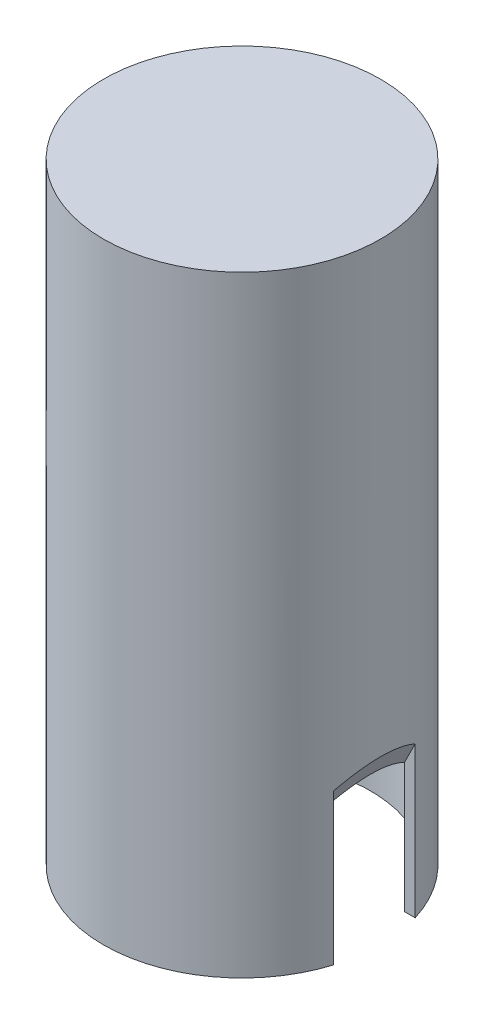
ISO-10303-21;
HEADER;
FILE_DESCRIPTION(('STEP AP214'),'2;1');
FILE_NAME('part.step','',(''),(''),'','','');
FILE_SCHEMA(('AUTOMOTIVE_DESIGN { 1 0 10303 214 1 1 1 1 }'));
ENDSEC;
DATA;
#1=APPLICATION_CONTEXT('core data for automotive mechanical design processes');
#2=APPLICATION_PROTOCOL_DEFINITION('international standard','automotive_design',2000,#1);
#3=PRODUCT_CONTEXT('',#1,'mechanical');
#4=PRODUCT('Part','Part','',(#3));
#5=PRODUCT_RELATED_PRODUCT_CATEGORY('part','',(#4));
#6=PRODUCT_DEFINITION_FORMATION('','',#4);
#7=PRODUCT_DEFINITION_CONTEXT('part definition',#1,'design');
#8=PRODUCT_DEFINITION('design','',#6,#7);
#9=PRODUCT_DEFINITION_SHAPE('','',#8);
#10=(LENGTH_UNIT() NAMED_UNIT(*) SI_UNIT(.MILLI.,.METRE.));
#11=(NAMED_UNIT(*) PLANE_ANGLE_UNIT() SI_UNIT($,.RADIAN.));
#12=(NAMED_UNIT(*) SI_UNIT($,.STERADIAN.) SOLID_ANGLE_UNIT());
#13=UNCERTAINTY_MEASURE_WITH_UNIT(LENGTH_MEASURE(1.E-05),#10,'distance_accuracy_value','');
#14=(GEOMETRIC_REPRESENTATION_CONTEXT(3) GLOBAL_UNCERTAINTY_ASSIGNED_CONTEXT((#13)) GLOBAL_UNIT_ASSIGNED_CONTEXT((#10,
#11,#12)) REPRESENTATION_CONTEXT('',''));
#15=CARTESIAN_POINT('',(0.,0.,0.));
#16=DIRECTION('',(0.,0.,1.));
#17=DIRECTION('',(1.,0.,0.));
#18=AXIS2_PLACEMENT_3D('',#15,#16,#17);
#19=CARTESIAN_POINT('',(0.,300.,0.));
#20=DIRECTION('',(0.,-1.,0.));
#21=DIRECTION('',(0.,0.,-1.));
#22=AXIS2_PLACEMENT_3D('',#19,#20,#21);
#23=CYLINDRICAL_SURFACE('',#22,68.);
#24=CARTESIAN_POINT('',(0.,300.,0.));
#25=DIRECTION('',(0.,1.,0.));
#26=DIRECTION('',(0.,0.,1.));
#27=AXIS2_PLACEMENT_3D('',#24,#25,#26);
#28=CIRCLE('',#27,68.);
#29=CARTESIAN_POINT('',(0.,300.,68.));
#30=VERTEX_POINT('',#29);
#31=EDGE_CURVE('E107',#30,#30,#28,.T.);
#32=ORIENTED_EDGE('',*,*,#31,.F.);
#33=EDGE_LOOP('',(#32));
#34=FACE_BOUND('',#33,.T.);
#35=CARTESIAN_POINT('',(0.,-56.,0.));
#36=DIRECTION('',(-0.894427190999916,-0.447213595499958,0.));
#37=DIRECTION('',(0.447213595499958,-0.894427190999916,0.));
#38=AXIS2_PLACEMENT_3D('',#35,#36,#37);
#39=ELLIPSE('',#38,152.052622469986,68.);
#40=CARTESIAN_POINT('',(-64.9923072370877,73.9846144741753,20.));
#41=VERTEX_POINT('',#40);
#42=CARTESIAN_POINT('',(-64.9923072370877,73.9846144741753,-20.));
#43=VERTEX_POINT('',#42);
#44=EDGE_CURVE('E130',#41,#43,#39,.T.);
#45=ORIENTED_EDGE('',*,*,#44,.F.);
#46=DIRECTION('',(0.,-1.,0.));
#47=VECTOR('',#46,1.);
#48=CARTESIAN_POINT('',(-64.9923072370877,300.,20.));
#49=LINE('',#48,#47);
#50=CARTESIAN_POINT('',(-64.9923072370877,0.,20.));
#51=VERTEX_POINT('',#50);
#52=EDGE_CURVE('E155',#41,#51,#49,.T.);
#53=ORIENTED_EDGE('',*,*,#52,.T.);
#54=CARTESIAN_POINT('',(0.,0.,0.));
#55=DIRECTION('',(0.,1.,0.));
#56=DIRECTION('',(0.,0.,1.));
#57=AXIS2_PLACEMENT_3D('',#54,#55,#56);
#58=CIRCLE('',#57,68.);
#59=CARTESIAN_POINT('',(64.9923072370877,0.,20.));
#60=VERTEX_POINT('',#59);
#61=EDGE_CURVE('E127',#51,#60,#58,.T.);
#62=ORIENTED_EDGE('',*,*,#61,.T.);
#63=DIRECTION('',(0.,-1.,0.));
#64=VECTOR('',#63,1.);
#65=CARTESIAN_POINT('',(64.9923072370877,300.,20.));
#66=LINE('',#65,#64);
#67=CARTESIAN_POINT('',(64.9923072370877,73.9846144741753,20.));
#68=VERTEX_POINT('',#67);
#69=EDGE_CURVE('E159',#68,#60,#66,.T.);
#70=ORIENTED_EDGE('',*,*,#69,.F.);
#71=CARTESIAN_POINT('',(0.,-56.,0.));
#72=DIRECTION('',(0.894427190999916,-0.447213595499958,0.));
#73=DIRECTION('',(-0.447213595499958,-0.894427190999916,0.));
#74=AXIS2_PLACEMENT_3D('',#71,#72,#73);
#75=ELLIPSE('',#74,152.052622469986,68.);
#76=CARTESIAN_POINT('',(64.9923072370877,73.9846144741753,-20.));
#77=VERTEX_POINT('',#76);
#78=EDGE_CURVE('E171',#77,#68,#75,.T.);
#79=ORIENTED_EDGE('',*,*,#78,.F.);
#80=DIRECTION('',(0.,-1.,0.));
#81=VECTOR('',#80,1.);
#82=CARTESIAN_POINT('',(64.9923072370877,300.,-20.));
#83=LINE('',#82,#81);
#84=CARTESIAN_POINT('',(64.9923072370877,0.,-20.));
#85=VERTEX_POINT('',#84);
#86=EDGE_CURVE('E156',#77,#85,#83,.T.);
#87=ORIENTED_EDGE('',*,*,#86,.T.);
#88=CARTESIAN_POINT('',(-64.9923072370877,0.,-20.));
#89=VERTEX_POINT('',#88);
#90=EDGE_CURVE('E115',#85,#89,#58,.T.);
#91=ORIENTED_EDGE('',*,*,#90,.T.);
#92=DIRECTION('',(0.,-1.,0.));
#93=VECTOR('',#92,1.);
#94=CARTESIAN_POINT('',(-64.9923072370877,300.,-20.));
#95=LINE('',#94,#93);
#96=EDGE_CURVE('E173',#43,#89,#95,.T.);
#97=ORIENTED_EDGE('',*,*,#96,.F.);
#98=EDGE_LOOP('',(#45,#53,#62,#70,#79,#87,#91,#97));
#99=FACE_BOUND('',#98,.T.);
#100=ADVANCED_FACE('F37',(#34,#99),#23,.T.);
#101=CARTESIAN_POINT('',(0.,0.,0.));
#102=DIRECTION('',(0.,1.,0.));
#103=DIRECTION('',(0.,0.,1.));
#104=AXIS2_PLACEMENT_3D('',#101,#102,#103);
#105=PLANE('',#104);
#106=DIRECTION('',(1.,0.,0.));
#107=VECTOR('',#106,1.);
#108=CARTESIAN_POINT('',(-68.,0.,-20.));
#109=LINE('',#108,#107);
#110=CARTESIAN_POINT('',(-59.7411081249754,0.,-20.));
#111=VERTEX_POINT('',#110);
#112=EDGE_CURVE('E59',#89,#111,#109,.T.);
#113=ORIENTED_EDGE('',*,*,#112,.F.);
#114=ORIENTED_EDGE('',*,*,#90,.F.);
#115=DIRECTION('',(1.,0.,0.));
#116=VECTOR('',#115,1.);
#117=CARTESIAN_POINT('',(68.,0.,-20.));
#118=LINE('',#117,#116);
#119=CARTESIAN_POINT('',(59.7411081249754,0.,-20.));
#120=VERTEX_POINT('',#119);
#121=EDGE_CURVE('E101',#120,#85,#118,.T.);
#122=ORIENTED_EDGE('',*,*,#121,.F.);
#123=CARTESIAN_POINT('',(0.,0.,0.));
#124=DIRECTION('',(0.,1.,0.));
#125=DIRECTION('',(0.,0.,1.));
#126=AXIS2_PLACEMENT_3D('',#123,#124,#125);
#127=CIRCLE('',#126,63.);
#128=EDGE_CURVE('E113',#120,#111,#127,.T.);
#129=ORIENTED_EDGE('',*,*,#128,.T.);
#130=EDGE_LOOP('',(#113,#114,#122,#129));
#131=FACE_BOUND('',#130,.T.);
#132=ADVANCED_FACE('F112',(#131),#105,.F.);
#133=ORIENTED_EDGE('',*,*,#61,.F.);
#134=DIRECTION('',(1.,0.,0.));
#135=VECTOR('',#134,1.);
#136=CARTESIAN_POINT('',(-68.,0.,20.));
#137=LINE('',#136,#135);
#138=CARTESIAN_POINT('',(-59.7411081249754,0.,20.));
#139=VERTEX_POINT('',#138);
#140=EDGE_CURVE('E157',#51,#139,#137,.T.);
#141=ORIENTED_EDGE('',*,*,#140,.T.);
#142=CARTESIAN_POINT('',(59.7411081249754,0.,20.));
#143=VERTEX_POINT('',#142);
#144=EDGE_CURVE('E124',#139,#143,#127,.T.);
#145=ORIENTED_EDGE('',*,*,#144,.T.);
#146=DIRECTION('',(1.,0.,0.));
#147=VECTOR('',#146,1.);
#148=CARTESIAN_POINT('',(68.,0.,20.));
#149=LINE('',#148,#147);
#150=EDGE_CURVE('E164',#143,#60,#149,.T.);
#151=ORIENTED_EDGE('',*,*,#150,.T.);
#152=EDGE_LOOP('',(#133,#141,#145,#151));
#153=FACE_BOUND('',#152,.T.);
#154=ADVANCED_FACE('F186',(#153),#105,.F.);
#155=CARTESIAN_POINT('',(0.,300.,0.));
#156=DIRECTION('',(0.,-1.,0.));
#157=DIRECTION('',(0.,0.,-1.));
#158=AXIS2_PLACEMENT_3D('',#155,#156,#157);
#159=CYLINDRICAL_SURFACE('',#158,63.);
#160=DIRECTION('',(0.,-1.,0.));
#161=VECTOR('',#160,1.);
#162=CARTESIAN_POINT('',(-59.7411081249754,300.,20.));
#163=LINE('',#162,#161);
#164=CARTESIAN_POINT('',(-59.7411081249754,63.4822162499508,20.));
#165=VERTEX_POINT('',#164);
#166=EDGE_CURVE('E11',#165,#139,#163,.T.);
#167=ORIENTED_EDGE('',*,*,#166,.F.);
#168=CARTESIAN_POINT('',(0.,-56.,0.));
#169=DIRECTION('',(-0.894427190999916,-0.447213595499958,0.));
#170=DIRECTION('',(0.447213595499958,-0.894427190999916,0.));
#171=AXIS2_PLACEMENT_3D('',#168,#169,#170);
#172=ELLIPSE('',#171,140.872282582487,63.);
#173=CARTESIAN_POINT('',(-59.7411081249754,63.4822162499508,-20.));
#174=VERTEX_POINT('',#173);
#175=EDGE_CURVE('E44',#165,#174,#172,.T.);
#176=ORIENTED_EDGE('',*,*,#175,.T.);
#177=DIRECTION('',(0.,-1.,0.));
#178=VECTOR('',#177,1.);
#179=CARTESIAN_POINT('',(-59.7411081249754,300.,-20.));
#180=LINE('',#179,#178);
#181=EDGE_CURVE('E122',#174,#111,#180,.T.);
#182=ORIENTED_EDGE('',*,*,#181,.T.);
#183=ORIENTED_EDGE('',*,*,#128,.F.);
#184=DIRECTION('',(0.,-1.,0.));
#185=VECTOR('',#184,1.);
#186=CARTESIAN_POINT('',(59.7411081249754,300.,-20.));
#187=LINE('',#186,#185);
#188=CARTESIAN_POINT('',(59.7411081249754,63.4822162499508,-20.));
#189=VERTEX_POINT('',#188);
#190=EDGE_CURVE('E98',#189,#120,#187,.T.);
#191=ORIENTED_EDGE('',*,*,#190,.F.);
#192=CARTESIAN_POINT('',(0.,-56.,0.));
#193=DIRECTION('',(0.894427190999916,-0.447213595499958,0.));
#194=DIRECTION('',(-0.447213595499958,-0.894427190999916,0.));
#195=AXIS2_PLACEMENT_3D('',#192,#193,#194);
#196=ELLIPSE('',#195,140.872282582487,63.);
#197=CARTESIAN_POINT('',(59.7411081249754,63.4822162499508,20.));
#198=VERTEX_POINT('',#197);
#199=EDGE_CURVE('E106',#189,#198,#196,.T.);
#200=ORIENTED_EDGE('',*,*,#199,.T.);
#201=DIRECTION('',(0.,-1.,0.));
#202=VECTOR('',#201,1.);
#203=CARTESIAN_POINT('',(59.7411081249754,300.,20.));
#204=LINE('',#203,#202);
#205=EDGE_CURVE('E138',#198,#143,#204,.T.);
#206=ORIENTED_EDGE('',*,*,#205,.T.);
#207=ORIENTED_EDGE('',*,*,#144,.F.);
#208=EDGE_LOOP('',(#167,#176,#182,#183,#191,#200,#206,#207));
#209=FACE_BOUND('',#208,.T.);
#210=CARTESIAN_POINT('',(0.,295.,0.));
#211=DIRECTION('',(0.,1.,0.));
#212=DIRECTION('',(0.,0.,1.));
#213=AXIS2_PLACEMENT_3D('',#210,#211,#212);
#214=CIRCLE('',#213,63.);
#215=CARTESIAN_POINT('',(0.,295.,63.));
#216=VERTEX_POINT('',#215);
#217=EDGE_CURVE('E123',#216,#216,#214,.T.);
#218=ORIENTED_EDGE('',*,*,#217,.T.);
#219=EDGE_LOOP('',(#218));
#220=FACE_BOUND('',#219,.T.);
#221=ADVANCED_FACE('F119',(#209,#220),#159,.F.);
#222=CARTESIAN_POINT('',(0.,300.,0.));
#223=DIRECTION('',(0.,1.,0.));
#224=DIRECTION('',(0.,0.,1.));
#225=AXIS2_PLACEMENT_3D('',#222,#223,#224);
#226=PLANE('',#225);
#227=ORIENTED_EDGE('',*,*,#31,.T.);
#228=EDGE_LOOP('',(#227));
#229=FACE_BOUND('',#228,.T.);
#230=ADVANCED_FACE('F204',(#229),#226,.T.);
#231=CARTESIAN_POINT('',(0.,295.,0.));
#232=DIRECTION('',(0.,1.,0.));
#233=DIRECTION('',(0.,0.,1.));
#234=AXIS2_PLACEMENT_3D('',#231,#232,#233);
#235=PLANE('',#234);
#236=ORIENTED_EDGE('',*,*,#217,.F.);
#237=EDGE_LOOP('',(#236));
#238=FACE_BOUND('',#237,.T.);
#239=ADVANCED_FACE('F195',(#238),#235,.F.);
#240=CARTESIAN_POINT('',(58.,60.,20.));
#241=DIRECTION('',(0.894427190999916,-0.447213595499958,0.));
#242=DIRECTION('',(0.447213595499958,0.894427190999916,0.));
#243=AXIS2_PLACEMENT_3D('',#240,#241,#242);
#244=PLANE('',#243);
#245=ORIENTED_EDGE('',*,*,#78,.T.);
#246=DIRECTION('',(-0.447213595499958,-0.894427190999916,0.));
#247=VECTOR('',#246,1.);
#248=CARTESIAN_POINT('',(58.,60.,20.));
#249=LINE('',#248,#247);
#250=EDGE_CURVE('E116',#68,#198,#249,.T.);
#251=ORIENTED_EDGE('',*,*,#250,.T.);
#252=ORIENTED_EDGE('',*,*,#199,.F.);
#253=DIRECTION('',(-0.447213595499958,-0.894427190999916,0.));
#254=VECTOR('',#253,1.);
#255=CARTESIAN_POINT('',(58.,60.,-20.));
#256=LINE('',#255,#254);
#257=EDGE_CURVE('E51',#77,#189,#256,.T.);
#258=ORIENTED_EDGE('',*,*,#257,.F.);
#259=EDGE_LOOP('',(#245,#251,#252,#258));
#260=FACE_BOUND('',#259,.T.);
#261=ADVANCED_FACE('F181',(#260),#244,.T.);
#262=CARTESIAN_POINT('',(0.,0.,20.));
#263=DIRECTION('',(0.,0.,-1.));
#264=DIRECTION('',(-1.,0.,0.));
#265=AXIS2_PLACEMENT_3D('',#262,#263,#264);
#266=PLANE('',#265);
#267=ORIENTED_EDGE('',*,*,#69,.T.);
#268=ORIENTED_EDGE('',*,*,#150,.F.);
#269=ORIENTED_EDGE('',*,*,#205,.F.);
#270=ORIENTED_EDGE('',*,*,#250,.F.);
#271=EDGE_LOOP('',(#267,#268,#269,#270));
#272=FACE_BOUND('',#271,.T.);
#273=ADVANCED_FACE('F187',(#272),#266,.T.);
#274=CARTESIAN_POINT('',(0.,0.,-20.));
#275=DIRECTION('',(0.,0.,-1.));
#276=DIRECTION('',(-1.,0.,0.));
#277=AXIS2_PLACEMENT_3D('',#274,#275,#276);
#278=PLANE('',#277);
#279=ORIENTED_EDGE('',*,*,#257,.T.);
#280=ORIENTED_EDGE('',*,*,#190,.T.);
#281=ORIENTED_EDGE('',*,*,#121,.T.);
#282=ORIENTED_EDGE('',*,*,#86,.F.);
#283=EDGE_LOOP('',(#279,#280,#281,#282));
#284=FACE_BOUND('',#283,.T.);
#285=ADVANCED_FACE('F100',(#284),#278,.F.);
#286=CARTESIAN_POINT('',(-58.,60.,20.));
#287=DIRECTION('',(-0.894427190999916,-0.447213595499958,0.));
#288=DIRECTION('',(0.447213595499958,-0.894427190999916,0.));
#289=AXIS2_PLACEMENT_3D('',#286,#287,#288);
#290=PLANE('',#289);
#291=ORIENTED_EDGE('',*,*,#44,.T.);
#292=DIRECTION('',(-0.447213595499958,0.894427190999916,0.));
#293=VECTOR('',#292,1.);
#294=CARTESIAN_POINT('',(-58.,60.,-20.));
#295=LINE('',#294,#293);
#296=EDGE_CURVE('E150',#174,#43,#295,.T.);
#297=ORIENTED_EDGE('',*,*,#296,.F.);
#298=ORIENTED_EDGE('',*,*,#175,.F.);
#299=DIRECTION('',(-0.447213595499958,0.894427190999916,0.));
#300=VECTOR('',#299,1.);
#301=CARTESIAN_POINT('',(-58.,60.,20.));
#302=LINE('',#301,#300);
#303=EDGE_CURVE('E147',#165,#41,#302,.T.);
#304=ORIENTED_EDGE('',*,*,#303,.T.);
#305=EDGE_LOOP('',(#291,#297,#298,#304));
#306=FACE_BOUND('',#305,.T.);
#307=ADVANCED_FACE('F146',(#306),#290,.T.);
#308=CARTESIAN_POINT('',(0.,0.,20.));
#309=DIRECTION('',(0.,0.,1.));
#310=DIRECTION('',(1.,0.,0.));
#311=AXIS2_PLACEMENT_3D('',#308,#309,#310);
#312=PLANE('',#311);
#313=ORIENTED_EDGE('',*,*,#303,.F.);
#314=ORIENTED_EDGE('',*,*,#166,.T.);
#315=ORIENTED_EDGE('',*,*,#140,.F.);
#316=ORIENTED_EDGE('',*,*,#52,.F.);
#317=EDGE_LOOP('',(#313,#314,#315,#316));
#318=FACE_BOUND('',#317,.T.);
#319=ADVANCED_FACE('F152',(#318),#312,.F.);
#320=CARTESIAN_POINT('',(0.,0.,-20.));
#321=DIRECTION('',(0.,0.,1.));
#322=DIRECTION('',(1.,0.,0.));
#323=AXIS2_PLACEMENT_3D('',#320,#321,#322);
#324=PLANE('',#323);
#325=ORIENTED_EDGE('',*,*,#96,.T.);
#326=ORIENTED_EDGE('',*,*,#112,.T.);
#327=ORIENTED_EDGE('',*,*,#181,.F.);
#328=ORIENTED_EDGE('',*,*,#296,.T.);
#329=EDGE_LOOP('',(#325,#326,#327,#328));
#330=FACE_BOUND('',#329,.T.);
#331=ADVANCED_FACE('F177',(#330),#324,.T.);
#332=CLOSED_SHELL('',(#100,#132,#154,#221,#230,#239,#261,#273,#285,#307,#319,#331));
#333=MANIFOLD_SOLID_BREP('B2',#332);
#334=ADVANCED_BREP_SHAPE_REPRESENTATION('',(#18,#333),#14);
#335=SHAPE_DEFINITION_REPRESENTATION(#9,#334);
ENDSEC;
END-ISO-10303-21;
